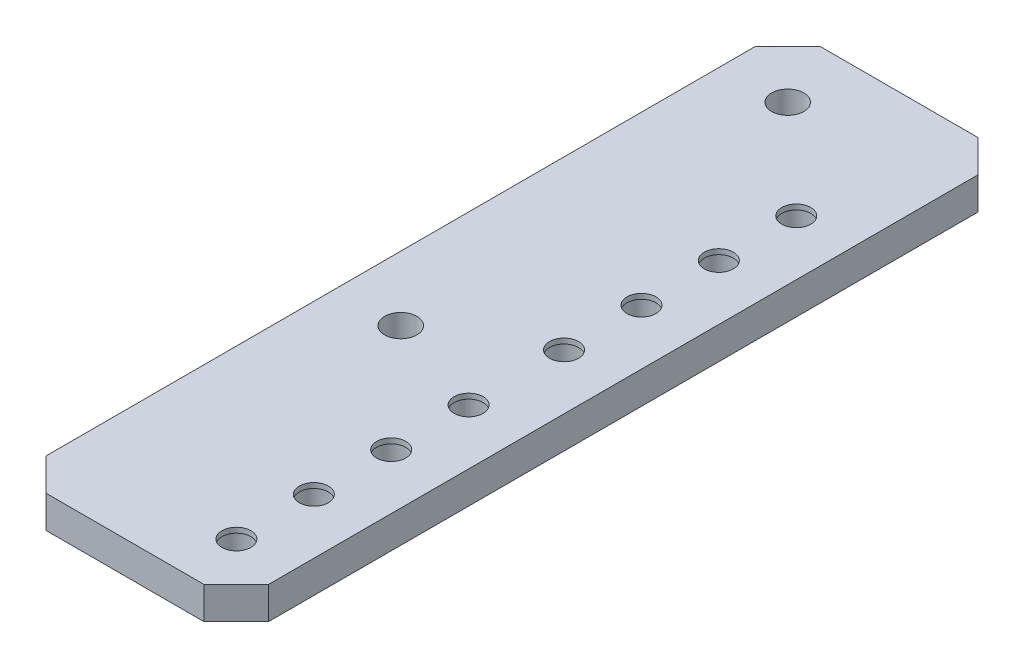
ISO-10303-21;
HEADER;
FILE_DESCRIPTION(('STEP AP214'),'2;1');
FILE_NAME('part.step','',(''),(''),'','','');
FILE_SCHEMA(('AUTOMOTIVE_DESIGN { 1 0 10303 214 1 1 1 1 }'));
ENDSEC;
DATA;
#1=APPLICATION_CONTEXT('core data for automotive mechanical design processes');
#2=APPLICATION_PROTOCOL_DEFINITION('international standard','automotive_design',2000,#1);
#3=PRODUCT_CONTEXT('',#1,'mechanical');
#4=PRODUCT('Part','Part','',(#3));
#5=PRODUCT_RELATED_PRODUCT_CATEGORY('part','',(#4));
#6=PRODUCT_DEFINITION_FORMATION('','',#4);
#7=PRODUCT_DEFINITION_CONTEXT('part definition',#1,'design');
#8=PRODUCT_DEFINITION('design','',#6,#7);
#9=PRODUCT_DEFINITION_SHAPE('','',#8);
#10=(LENGTH_UNIT() NAMED_UNIT(*) SI_UNIT(.MILLI.,.METRE.));
#11=(NAMED_UNIT(*) PLANE_ANGLE_UNIT() SI_UNIT($,.RADIAN.));
#12=(NAMED_UNIT(*) SI_UNIT($,.STERADIAN.) SOLID_ANGLE_UNIT());
#13=UNCERTAINTY_MEASURE_WITH_UNIT(LENGTH_MEASURE(1.E-05),#10,'distance_accuracy_value','');
#14=(GEOMETRIC_REPRESENTATION_CONTEXT(3) GLOBAL_UNCERTAINTY_ASSIGNED_CONTEXT((#13)) GLOBAL_UNIT_ASSIGNED_CONTEXT((#10,
#11,#12)) REPRESENTATION_CONTEXT('',''));
#15=CARTESIAN_POINT('',(0.,0.,0.));
#16=DIRECTION('',(0.,0.,1.));
#17=DIRECTION('',(1.,0.,0.));
#18=AXIS2_PLACEMENT_3D('',#15,#16,#17);
#19=CARTESIAN_POINT('',(17.25,5.,60.));
#20=DIRECTION('',(-1.,0.,0.));
#21=DIRECTION('',(0.,0.,1.));
#22=AXIS2_PLACEMENT_3D('',#19,#20,#21);
#23=PLANE('',#22);
#24=DIRECTION('',(0.,0.,-1.));
#25=VECTOR('',#24,1.);
#26=CARTESIAN_POINT('',(17.25,0.,60.));
#27=LINE('',#26,#25);
#28=CARTESIAN_POINT('',(17.25,0.,55.));
#29=VERTEX_POINT('',#28);
#30=CARTESIAN_POINT('',(17.25,0.,-55.));
#31=VERTEX_POINT('',#30);
#32=EDGE_CURVE('E139',#29,#31,#27,.T.);
#33=ORIENTED_EDGE('',*,*,#32,.T.);
#34=DIRECTION('',(0.,1.,0.));
#35=VECTOR('',#34,1.);
#36=CARTESIAN_POINT('',(17.25,5.,-55.));
#37=LINE('',#36,#35);
#38=CARTESIAN_POINT('',(17.25,5.,-55.));
#39=VERTEX_POINT('',#38);
#40=EDGE_CURVE('E114',#31,#39,#37,.T.);
#41=ORIENTED_EDGE('',*,*,#40,.T.);
#42=DIRECTION('',(0.,0.,-1.));
#43=VECTOR('',#42,1.);
#44=CARTESIAN_POINT('',(17.25,5.,60.));
#45=LINE('',#44,#43);
#46=CARTESIAN_POINT('',(17.25,5.,55.));
#47=VERTEX_POINT('',#46);
#48=EDGE_CURVE('E152',#47,#39,#45,.T.);
#49=ORIENTED_EDGE('',*,*,#48,.F.);
#50=DIRECTION('',(0.,-1.,0.));
#51=VECTOR('',#50,1.);
#52=CARTESIAN_POINT('',(17.25,5.,55.));
#53=LINE('',#52,#51);
#54=EDGE_CURVE('E120',#47,#29,#53,.T.);
#55=ORIENTED_EDGE('',*,*,#54,.T.);
#56=EDGE_LOOP('',(#33,#41,#49,#55));
#57=FACE_BOUND('',#56,.T.);
#58=ADVANCED_FACE('F41',(#57),#23,.F.);
#59=CARTESIAN_POINT('',(-17.25,5.,-60.));
#60=DIRECTION('',(0.,0.,1.));
#61=DIRECTION('',(1.,0.,0.));
#62=AXIS2_PLACEMENT_3D('',#59,#60,#61);
#63=PLANE('',#62);
#64=DIRECTION('',(-1.,0.,0.));
#65=VECTOR('',#64,1.);
#66=CARTESIAN_POINT('',(-17.25,5.,-60.));
#67=LINE('',#66,#65);
#68=CARTESIAN_POINT('',(12.25,5.,-60.));
#69=VERTEX_POINT('',#68);
#70=CARTESIAN_POINT('',(-12.25,5.,-60.));
#71=VERTEX_POINT('',#70);
#72=EDGE_CURVE('E130',#69,#71,#67,.T.);
#73=ORIENTED_EDGE('',*,*,#72,.F.);
#74=DIRECTION('',(0.,-1.,0.));
#75=VECTOR('',#74,1.);
#76=CARTESIAN_POINT('',(12.25,5.,-60.));
#77=LINE('',#76,#75);
#78=CARTESIAN_POINT('',(12.25,0.,-60.));
#79=VERTEX_POINT('',#78);
#80=EDGE_CURVE('E113',#69,#79,#77,.T.);
#81=ORIENTED_EDGE('',*,*,#80,.T.);
#82=DIRECTION('',(-1.,0.,0.));
#83=VECTOR('',#82,1.);
#84=CARTESIAN_POINT('',(-17.25,0.,-60.));
#85=LINE('',#84,#83);
#86=CARTESIAN_POINT('',(-12.25,0.,-60.));
#87=VERTEX_POINT('',#86);
#88=EDGE_CURVE('E127',#79,#87,#85,.T.);
#89=ORIENTED_EDGE('',*,*,#88,.T.);
#90=DIRECTION('',(0.,1.,0.));
#91=VECTOR('',#90,1.);
#92=CARTESIAN_POINT('',(-12.25,5.,-60.));
#93=LINE('',#92,#91);
#94=EDGE_CURVE('E133',#87,#71,#93,.T.);
#95=ORIENTED_EDGE('',*,*,#94,.T.);
#96=EDGE_LOOP('',(#73,#81,#89,#95));
#97=FACE_BOUND('',#96,.T.);
#98=ADVANCED_FACE('F126',(#97),#63,.F.);
#99=CARTESIAN_POINT('',(-17.25,5.,60.));
#100=DIRECTION('',(1.,0.,0.));
#101=DIRECTION('',(0.,0.,-1.));
#102=AXIS2_PLACEMENT_3D('',#99,#100,#101);
#103=PLANE('',#102);
#104=DIRECTION('',(0.,0.,1.));
#105=VECTOR('',#104,1.);
#106=CARTESIAN_POINT('',(-17.25,0.,60.));
#107=LINE('',#106,#105);
#108=CARTESIAN_POINT('',(-17.25,0.,-55.));
#109=VERTEX_POINT('',#108);
#110=CARTESIAN_POINT('',(-17.25,0.,55.));
#111=VERTEX_POINT('',#110);
#112=EDGE_CURVE('E138',#109,#111,#107,.T.);
#113=ORIENTED_EDGE('',*,*,#112,.T.);
#114=DIRECTION('',(0.,1.,0.));
#115=VECTOR('',#114,1.);
#116=CARTESIAN_POINT('',(-17.25,5.,55.));
#117=LINE('',#116,#115);
#118=CARTESIAN_POINT('',(-17.25,5.,55.));
#119=VERTEX_POINT('',#118);
#120=EDGE_CURVE('E11',#111,#119,#117,.T.);
#121=ORIENTED_EDGE('',*,*,#120,.T.);
#122=DIRECTION('',(0.,0.,1.));
#123=VECTOR('',#122,1.);
#124=CARTESIAN_POINT('',(-17.25,5.,60.));
#125=LINE('',#124,#123);
#126=CARTESIAN_POINT('',(-17.25,5.,-55.));
#127=VERTEX_POINT('',#126);
#128=EDGE_CURVE('E249',#127,#119,#125,.T.);
#129=ORIENTED_EDGE('',*,*,#128,.F.);
#130=DIRECTION('',(0.,-1.,0.));
#131=VECTOR('',#130,1.);
#132=CARTESIAN_POINT('',(-17.25,5.,-55.));
#133=LINE('',#132,#131);
#134=EDGE_CURVE('E51',#127,#109,#133,.T.);
#135=ORIENTED_EDGE('',*,*,#134,.T.);
#136=EDGE_LOOP('',(#113,#121,#129,#135));
#137=FACE_BOUND('',#136,.T.);
#138=ADVANCED_FACE('F247',(#137),#103,.F.);
#139=CARTESIAN_POINT('',(-17.25,5.,60.));
#140=DIRECTION('',(0.,0.,-1.));
#141=DIRECTION('',(-1.,0.,0.));
#142=AXIS2_PLACEMENT_3D('',#139,#140,#141);
#143=PLANE('',#142);
#144=DIRECTION('',(1.,0.,0.));
#145=VECTOR('',#144,1.);
#146=CARTESIAN_POINT('',(-17.25,0.,60.));
#147=LINE('',#146,#145);
#148=CARTESIAN_POINT('',(-12.25,0.,60.));
#149=VERTEX_POINT('',#148);
#150=CARTESIAN_POINT('',(12.25,0.,60.));
#151=VERTEX_POINT('',#150);
#152=EDGE_CURVE('E144',#149,#151,#147,.T.);
#153=ORIENTED_EDGE('',*,*,#152,.T.);
#154=DIRECTION('',(0.,1.,0.));
#155=VECTOR('',#154,1.);
#156=CARTESIAN_POINT('',(12.25,5.,60.));
#157=LINE('',#156,#155);
#158=CARTESIAN_POINT('',(12.25,5.,60.));
#159=VERTEX_POINT('',#158);
#160=EDGE_CURVE('E58',#151,#159,#157,.T.);
#161=ORIENTED_EDGE('',*,*,#160,.T.);
#162=DIRECTION('',(1.,0.,0.));
#163=VECTOR('',#162,1.);
#164=CARTESIAN_POINT('',(-17.25,5.,60.));
#165=LINE('',#164,#163);
#166=CARTESIAN_POINT('',(-12.25,5.,60.));
#167=VERTEX_POINT('',#166);
#168=EDGE_CURVE('E212',#167,#159,#165,.T.);
#169=ORIENTED_EDGE('',*,*,#168,.F.);
#170=DIRECTION('',(0.,-1.,0.));
#171=VECTOR('',#170,1.);
#172=CARTESIAN_POINT('',(-12.25,5.,60.));
#173=LINE('',#172,#171);
#174=EDGE_CURVE('E237',#167,#149,#173,.T.);
#175=ORIENTED_EDGE('',*,*,#174,.T.);
#176=EDGE_LOOP('',(#153,#161,#169,#175));
#177=FACE_BOUND('',#176,.T.);
#178=ADVANCED_FACE('F256',(#177),#143,.F.);
#179=CARTESIAN_POINT('',(0.,5.,0.));
#180=DIRECTION('',(0.,-1.,0.));
#181=DIRECTION('',(0.,0.,-1.));
#182=AXIS2_PLACEMENT_3D('',#179,#180,#181);
#183=PLANE('',#182);
#184=CARTESIAN_POINT('',(8.67200000000001,5.,0.600000000000003));
#185=DIRECTION('',(0.,-1.,0.));
#186=DIRECTION('',(0.,0.,-1.));
#187=AXIS2_PLACEMENT_3D('',#184,#185,#186);
#188=CIRCLE('',#187,2.25);
#189=CARTESIAN_POINT('',(8.67200000000001,5.,-1.65));
#190=VERTEX_POINT('',#189);
#191=EDGE_CURVE('E205',#190,#190,#188,.T.);
#192=ORIENTED_EDGE('',*,*,#191,.T.);
#193=EDGE_LOOP('',(#192));
#194=FACE_BOUND('',#193,.T.);
#195=CARTESIAN_POINT('',(8.67200000000001,5.,51.4));
#196=DIRECTION('',(0.,-1.,0.));
#197=DIRECTION('',(0.,0.,-1.));
#198=AXIS2_PLACEMENT_3D('',#195,#196,#197);
#199=CIRCLE('',#198,2.25);
#200=CARTESIAN_POINT('',(8.67200000000001,5.,49.15));
#201=VERTEX_POINT('',#200);
#202=EDGE_CURVE('E199',#201,#201,#199,.T.);
#203=ORIENTED_EDGE('',*,*,#202,.T.);
#204=EDGE_LOOP('',(#203));
#205=FACE_BOUND('',#204,.T.);
#206=CARTESIAN_POINT('',(8.67200000000001,5.,-11.4));
#207=DIRECTION('',(0.,-1.,0.));
#208=DIRECTION('',(0.,0.,-1.));
#209=AXIS2_PLACEMENT_3D('',#206,#207,#208);
#210=CIRCLE('',#209,2.25);
#211=CARTESIAN_POINT('',(8.67200000000001,5.,-13.65));
#212=VERTEX_POINT('',#211);
#213=EDGE_CURVE('E193',#212,#212,#210,.T.);
#214=ORIENTED_EDGE('',*,*,#213,.T.);
#215=EDGE_LOOP('',(#214));
#216=FACE_BOUND('',#215,.T.);
#217=CARTESIAN_POINT('',(8.67200000000001,5.,39.4));
#218=DIRECTION('',(0.,-1.,0.));
#219=DIRECTION('',(0.,0.,-1.));
#220=AXIS2_PLACEMENT_3D('',#217,#218,#219);
#221=CIRCLE('',#220,2.25);
#222=CARTESIAN_POINT('',(8.67200000000001,5.,37.15));
#223=VERTEX_POINT('',#222);
#224=EDGE_CURVE('E187',#223,#223,#221,.T.);
#225=ORIENTED_EDGE('',*,*,#224,.T.);
#226=EDGE_LOOP('',(#225));
#227=FACE_BOUND('',#226,.T.);
#228=CARTESIAN_POINT('',(8.67200000000001,5.,-23.4));
#229=DIRECTION('',(0.,-1.,0.));
#230=DIRECTION('',(0.,0.,-1.));
#231=AXIS2_PLACEMENT_3D('',#228,#229,#230);
#232=CIRCLE('',#231,2.25);
#233=CARTESIAN_POINT('',(8.67200000000001,5.,-25.65));
#234=VERTEX_POINT('',#233);
#235=EDGE_CURVE('E181',#234,#234,#232,.T.);
#236=ORIENTED_EDGE('',*,*,#235,.T.);
#237=EDGE_LOOP('',(#236));
#238=FACE_BOUND('',#237,.T.);
#239=CARTESIAN_POINT('',(8.67200000000001,5.,27.4));
#240=DIRECTION('',(0.,-1.,0.));
#241=DIRECTION('',(0.,0.,-1.));
#242=AXIS2_PLACEMENT_3D('',#239,#240,#241);
#243=CIRCLE('',#242,2.25);
#244=CARTESIAN_POINT('',(8.67200000000001,5.,25.15));
#245=VERTEX_POINT('',#244);
#246=EDGE_CURVE('E175',#245,#245,#243,.T.);
#247=ORIENTED_EDGE('',*,*,#246,.T.);
#248=EDGE_LOOP('',(#247));
#249=FACE_BOUND('',#248,.T.);
#250=CARTESIAN_POINT('',(8.67200000000001,5.,-35.4));
#251=DIRECTION('',(0.,-1.,0.));
#252=DIRECTION('',(0.,0.,-1.));
#253=AXIS2_PLACEMENT_3D('',#250,#251,#252);
#254=CIRCLE('',#253,2.25);
#255=CARTESIAN_POINT('',(8.67200000000001,5.,-37.65));
#256=VERTEX_POINT('',#255);
#257=EDGE_CURVE('E169',#256,#256,#254,.T.);
#258=ORIENTED_EDGE('',*,*,#257,.T.);
#259=EDGE_LOOP('',(#258));
#260=FACE_BOUND('',#259,.T.);
#261=CARTESIAN_POINT('',(8.67200000000001,5.,15.4));
#262=DIRECTION('',(0.,-1.,0.));
#263=DIRECTION('',(0.,0.,-1.));
#264=AXIS2_PLACEMENT_3D('',#261,#262,#263);
#265=CIRCLE('',#264,2.25);
#266=CARTESIAN_POINT('',(8.67200000000001,5.,13.15));
#267=VERTEX_POINT('',#266);
#268=EDGE_CURVE('E163',#267,#267,#265,.T.);
#269=ORIENTED_EDGE('',*,*,#268,.T.);
#270=EDGE_LOOP('',(#269));
#271=FACE_BOUND('',#270,.T.);
#272=CARTESIAN_POINT('',(-7.25,5.,-50.));
#273=DIRECTION('',(0.,1.,0.));
#274=DIRECTION('',(0.,0.,1.));
#275=AXIS2_PLACEMENT_3D('',#272,#273,#274);
#276=CIRCLE('',#275,2.5);
#277=CARTESIAN_POINT('',(-7.25,5.,-47.5));
#278=VERTEX_POINT('',#277);
#279=EDGE_CURVE('E167',#278,#278,#276,.T.);
#280=ORIENTED_EDGE('',*,*,#279,.F.);
#281=EDGE_LOOP('',(#280));
#282=FACE_BOUND('',#281,.T.);
#283=CARTESIAN_POINT('',(-7.24999999999999,5.,10.));
#284=DIRECTION('',(0.,1.,0.));
#285=DIRECTION('',(0.,0.,1.));
#286=AXIS2_PLACEMENT_3D('',#283,#284,#285);
#287=CIRCLE('',#286,2.5);
#288=CARTESIAN_POINT('',(-7.24999999999999,5.,12.5));
#289=VERTEX_POINT('',#288);
#290=EDGE_CURVE('E161',#289,#289,#287,.T.);
#291=ORIENTED_EDGE('',*,*,#290,.F.);
#292=EDGE_LOOP('',(#291));
#293=FACE_BOUND('',#292,.T.);
#294=ORIENTED_EDGE('',*,*,#48,.T.);
#295=DIRECTION('',(0.707106781186546,0.,0.70710678118655));
#296=VECTOR('',#295,1.);
#297=CARTESIAN_POINT('',(12.25,5.,-60.));
#298=LINE('',#297,#296);
#299=EDGE_CURVE('E234',#39,#69,#298,.F.);
#300=ORIENTED_EDGE('',*,*,#299,.T.);
#301=ORIENTED_EDGE('',*,*,#72,.T.);
#302=DIRECTION('',(0.707106781186549,0.,-0.707106781186546));
#303=VECTOR('',#302,1.);
#304=CARTESIAN_POINT('',(-17.25,5.,-55.));
#305=LINE('',#304,#303);
#306=EDGE_CURVE('E226',#71,#127,#305,.F.);
#307=ORIENTED_EDGE('',*,*,#306,.T.);
#308=ORIENTED_EDGE('',*,*,#128,.T.);
#309=DIRECTION('',(-0.707106781186546,0.,-0.70710678118655));
#310=VECTOR('',#309,1.);
#311=CARTESIAN_POINT('',(-12.25,5.,60.));
#312=LINE('',#311,#310);
#313=EDGE_CURVE('E65',#119,#167,#312,.F.);
#314=ORIENTED_EDGE('',*,*,#313,.T.);
#315=ORIENTED_EDGE('',*,*,#168,.T.);
#316=DIRECTION('',(-0.707106781186549,0.,0.707106781186546));
#317=VECTOR('',#316,1.);
#318=CARTESIAN_POINT('',(17.25,5.,55.));
#319=LINE('',#318,#317);
#320=EDGE_CURVE('E231',#159,#47,#319,.F.);
#321=ORIENTED_EDGE('',*,*,#320,.T.);
#322=EDGE_LOOP('',(#294,#300,#301,#307,#308,#314,#315,#321));
#323=FACE_BOUND('',#322,.T.);
#324=ADVANCED_FACE('F374',(#194,#205,#216,#227,#238,#249,#260,#271,#282,#293,#323),#183,.F.);
#325=CARTESIAN_POINT('',(0.,0.,0.));
#326=DIRECTION('',(0.,-1.,0.));
#327=DIRECTION('',(0.,0.,-1.));
#328=AXIS2_PLACEMENT_3D('',#325,#326,#327);
#329=PLANE('',#328);
#330=CARTESIAN_POINT('',(8.67200000000001,0.,0.600000000000003));
#331=DIRECTION('',(0.,-1.,0.));
#332=DIRECTION('',(0.,0.,-1.));
#333=AXIS2_PLACEMENT_3D('',#330,#331,#332);
#334=CIRCLE('',#333,2.5);
#335=CARTESIAN_POINT('',(8.67200000000001,0.,-1.9));
#336=VERTEX_POINT('',#335);
#337=EDGE_CURVE('E364',#336,#336,#334,.T.);
#338=ORIENTED_EDGE('',*,*,#337,.F.);
#339=EDGE_LOOP('',(#338));
#340=FACE_BOUND('',#339,.T.);
#341=CARTESIAN_POINT('',(8.67200000000001,0.,51.4));
#342=DIRECTION('',(0.,-1.,0.));
#343=DIRECTION('',(0.,0.,-1.));
#344=AXIS2_PLACEMENT_3D('',#341,#342,#343);
#345=CIRCLE('',#344,2.5);
#346=CARTESIAN_POINT('',(8.67200000000001,0.,48.9));
#347=VERTEX_POINT('',#346);
#348=EDGE_CURVE('E209',#347,#347,#345,.T.);
#349=ORIENTED_EDGE('',*,*,#348,.F.);
#350=EDGE_LOOP('',(#349));
#351=FACE_BOUND('',#350,.T.);
#352=CARTESIAN_POINT('',(8.67200000000001,0.,-11.4));
#353=DIRECTION('',(0.,-1.,0.));
#354=DIRECTION('',(0.,0.,-1.));
#355=AXIS2_PLACEMENT_3D('',#352,#353,#354);
#356=CIRCLE('',#355,2.5);
#357=CARTESIAN_POINT('',(8.67200000000001,0.,-13.9));
#358=VERTEX_POINT('',#357);
#359=EDGE_CURVE('E203',#358,#358,#356,.T.);
#360=ORIENTED_EDGE('',*,*,#359,.F.);
#361=EDGE_LOOP('',(#360));
#362=FACE_BOUND('',#361,.T.);
#363=CARTESIAN_POINT('',(8.67200000000001,0.,39.4));
#364=DIRECTION('',(0.,-1.,0.));
#365=DIRECTION('',(0.,0.,-1.));
#366=AXIS2_PLACEMENT_3D('',#363,#364,#365);
#367=CIRCLE('',#366,2.5);
#368=CARTESIAN_POINT('',(8.67200000000001,0.,36.9));
#369=VERTEX_POINT('',#368);
#370=EDGE_CURVE('E197',#369,#369,#367,.T.);
#371=ORIENTED_EDGE('',*,*,#370,.F.);
#372=EDGE_LOOP('',(#371));
#373=FACE_BOUND('',#372,.T.);
#374=CARTESIAN_POINT('',(8.67200000000001,0.,-23.4));
#375=DIRECTION('',(0.,-1.,0.));
#376=DIRECTION('',(0.,0.,-1.));
#377=AXIS2_PLACEMENT_3D('',#374,#375,#376);
#378=CIRCLE('',#377,2.5);
#379=CARTESIAN_POINT('',(8.67200000000001,0.,-25.9));
#380=VERTEX_POINT('',#379);
#381=EDGE_CURVE('E191',#380,#380,#378,.T.);
#382=ORIENTED_EDGE('',*,*,#381,.F.);
#383=EDGE_LOOP('',(#382));
#384=FACE_BOUND('',#383,.T.);
#385=CARTESIAN_POINT('',(8.67200000000001,0.,27.4));
#386=DIRECTION('',(0.,-1.,0.));
#387=DIRECTION('',(0.,0.,-1.));
#388=AXIS2_PLACEMENT_3D('',#385,#386,#387);
#389=CIRCLE('',#388,2.5);
#390=CARTESIAN_POINT('',(8.67200000000001,0.,24.9));
#391=VERTEX_POINT('',#390);
#392=EDGE_CURVE('E185',#391,#391,#389,.T.);
#393=ORIENTED_EDGE('',*,*,#392,.F.);
#394=EDGE_LOOP('',(#393));
#395=FACE_BOUND('',#394,.T.);
#396=CARTESIAN_POINT('',(8.67200000000001,0.,-35.4));
#397=DIRECTION('',(0.,-1.,0.));
#398=DIRECTION('',(0.,0.,-1.));
#399=AXIS2_PLACEMENT_3D('',#396,#397,#398);
#400=CIRCLE('',#399,2.5);
#401=CARTESIAN_POINT('',(8.67200000000001,0.,-37.9));
#402=VERTEX_POINT('',#401);
#403=EDGE_CURVE('E179',#402,#402,#400,.T.);
#404=ORIENTED_EDGE('',*,*,#403,.F.);
#405=EDGE_LOOP('',(#404));
#406=FACE_BOUND('',#405,.T.);
#407=CARTESIAN_POINT('',(8.67200000000001,0.,15.4));
#408=DIRECTION('',(0.,-1.,0.));
#409=DIRECTION('',(0.,0.,-1.));
#410=AXIS2_PLACEMENT_3D('',#407,#408,#409);
#411=CIRCLE('',#410,2.5);
#412=CARTESIAN_POINT('',(8.67200000000001,0.,12.9));
#413=VERTEX_POINT('',#412);
#414=EDGE_CURVE('E173',#413,#413,#411,.T.);
#415=ORIENTED_EDGE('',*,*,#414,.F.);
#416=EDGE_LOOP('',(#415));
#417=FACE_BOUND('',#416,.T.);
#418=CARTESIAN_POINT('',(-7.25,0.,-50.));
#419=DIRECTION('',(0.,-1.,0.));
#420=DIRECTION('',(0.,0.,-1.));
#421=AXIS2_PLACEMENT_3D('',#418,#419,#420);
#422=CIRCLE('',#421,2.25);
#423=CARTESIAN_POINT('',(-7.25,0.,-52.25));
#424=VERTEX_POINT('',#423);
#425=EDGE_CURVE('E157',#424,#424,#422,.T.);
#426=ORIENTED_EDGE('',*,*,#425,.F.);
#427=EDGE_LOOP('',(#426));
#428=FACE_BOUND('',#427,.T.);
#429=CARTESIAN_POINT('',(-7.24999999999999,0.,10.));
#430=DIRECTION('',(0.,-1.,0.));
#431=DIRECTION('',(0.,0.,-1.));
#432=AXIS2_PLACEMENT_3D('',#429,#430,#431);
#433=CIRCLE('',#432,2.25);
#434=CARTESIAN_POINT('',(-7.24999999999999,0.,7.75000000000001));
#435=VERTEX_POINT('',#434);
#436=EDGE_CURVE('E146',#435,#435,#433,.T.);
#437=ORIENTED_EDGE('',*,*,#436,.F.);
#438=EDGE_LOOP('',(#437));
#439=FACE_BOUND('',#438,.T.);
#440=ORIENTED_EDGE('',*,*,#88,.F.);
#441=DIRECTION('',(-0.707106781186546,0.,-0.70710678118655));
#442=VECTOR('',#441,1.);
#443=CARTESIAN_POINT('',(36.125,0.,-36.1249999999998));
#444=LINE('',#443,#442);
#445=EDGE_CURVE('E109',#79,#31,#444,.F.);
#446=ORIENTED_EDGE('',*,*,#445,.T.);
#447=ORIENTED_EDGE('',*,*,#32,.F.);
#448=DIRECTION('',(0.707106781186549,0.,-0.707106781186546));
#449=VECTOR('',#448,1.);
#450=CARTESIAN_POINT('',(36.125,0.,36.1250000000001));
#451=LINE('',#450,#449);
#452=EDGE_CURVE('E121',#29,#151,#451,.F.);
#453=ORIENTED_EDGE('',*,*,#452,.T.);
#454=ORIENTED_EDGE('',*,*,#152,.F.);
#455=DIRECTION('',(0.707106781186546,0.,0.70710678118655));
#456=VECTOR('',#455,1.);
#457=CARTESIAN_POINT('',(-36.125,0.,36.1249999999998));
#458=LINE('',#457,#456);
#459=EDGE_CURVE('E216',#149,#111,#458,.F.);
#460=ORIENTED_EDGE('',*,*,#459,.T.);
#461=ORIENTED_EDGE('',*,*,#112,.F.);
#462=DIRECTION('',(-0.707106781186549,0.,0.707106781186546));
#463=VECTOR('',#462,1.);
#464=CARTESIAN_POINT('',(-36.125,0.,-36.1250000000001));
#465=LINE('',#464,#463);
#466=EDGE_CURVE('E132',#109,#87,#465,.F.);
#467=ORIENTED_EDGE('',*,*,#466,.T.);
#468=EDGE_LOOP('',(#440,#446,#447,#453,#454,#460,#461,#467));
#469=FACE_BOUND('',#468,.T.);
#470=ADVANCED_FACE('F135',(#340,#351,#362,#373,#384,#395,#406,#417,#428,#439,#469),#329,.T.);
#471=CARTESIAN_POINT('',(-7.24999999999999,5.,10.));
#472=DIRECTION('',(0.,1.,0.));
#473=DIRECTION('',(0.,0.,1.));
#474=AXIS2_PLACEMENT_3D('',#471,#472,#473);
#475=CYLINDRICAL_SURFACE('',#474,2.25);
#476=ORIENTED_EDGE('',*,*,#436,.T.);
#477=EDGE_LOOP('',(#476));
#478=FACE_BOUND('',#477,.T.);
#479=CARTESIAN_POINT('',(-7.24999999999999,0.799999999999999,10.));
#480=DIRECTION('',(0.,1.,0.));
#481=DIRECTION('',(0.,0.,1.));
#482=AXIS2_PLACEMENT_3D('',#479,#480,#481);
#483=CIRCLE('',#482,2.25);
#484=CARTESIAN_POINT('',(-7.24999999999999,0.799999999999999,12.25));
#485=VERTEX_POINT('',#484);
#486=EDGE_CURVE('E156',#485,#485,#483,.T.);
#487=ORIENTED_EDGE('',*,*,#486,.T.);
#488=EDGE_LOOP('',(#487));
#489=FACE_BOUND('',#488,.T.);
#490=ADVANCED_FACE('F373',(#478,#489),#475,.F.);
#491=CARTESIAN_POINT('',(-4.99999999999999,0.799999999999999,10.));
#492=DIRECTION('',(0.,-1.,0.));
#493=DIRECTION('',(0.,0.,-1.));
#494=AXIS2_PLACEMENT_3D('',#491,#492,#493);
#495=PLANE('',#494);
#496=ORIENTED_EDGE('',*,*,#486,.F.);
#497=EDGE_LOOP('',(#496));
#498=FACE_BOUND('',#497,.T.);
#499=CARTESIAN_POINT('',(-7.24999999999999,0.799999999999999,10.));
#500=DIRECTION('',(0.,1.,0.));
#501=DIRECTION('',(0.,0.,1.));
#502=AXIS2_PLACEMENT_3D('',#499,#500,#501);
#503=CIRCLE('',#502,2.5);
#504=CARTESIAN_POINT('',(-7.24999999999999,0.799999999999999,12.5));
#505=VERTEX_POINT('',#504);
#506=EDGE_CURVE('E270',#505,#505,#503,.T.);
#507=ORIENTED_EDGE('',*,*,#506,.T.);
#508=EDGE_LOOP('',(#507));
#509=FACE_BOUND('',#508,.T.);
#510=ADVANCED_FACE('F396',(#498,#509),#495,.F.);
#511=CARTESIAN_POINT('',(-7.24999999999999,5.,10.));
#512=DIRECTION('',(0.,1.,0.));
#513=DIRECTION('',(0.,0.,1.));
#514=AXIS2_PLACEMENT_3D('',#511,#512,#513);
#515=CYLINDRICAL_SURFACE('',#514,2.5);
#516=ORIENTED_EDGE('',*,*,#506,.F.);
#517=EDGE_LOOP('',(#516));
#518=FACE_BOUND('',#517,.T.);
#519=ORIENTED_EDGE('',*,*,#290,.T.);
#520=EDGE_LOOP('',(#519));
#521=FACE_BOUND('',#520,.T.);
#522=ADVANCED_FACE('F402',(#518,#521),#515,.F.);
#523=CARTESIAN_POINT('',(-7.25,5.,-50.));
#524=DIRECTION('',(0.,1.,0.));
#525=DIRECTION('',(0.,0.,1.));
#526=AXIS2_PLACEMENT_3D('',#523,#524,#525);
#527=CYLINDRICAL_SURFACE('',#526,2.25);
#528=ORIENTED_EDGE('',*,*,#425,.T.);
#529=EDGE_LOOP('',(#528));
#530=FACE_BOUND('',#529,.T.);
#531=CARTESIAN_POINT('',(-7.25,0.799999999999999,-50.));
#532=DIRECTION('',(0.,1.,0.));
#533=DIRECTION('',(0.,0.,1.));
#534=AXIS2_PLACEMENT_3D('',#531,#532,#533);
#535=CIRCLE('',#534,2.25);
#536=CARTESIAN_POINT('',(-7.25,0.799999999999999,-47.75));
#537=VERTEX_POINT('',#536);
#538=EDGE_CURVE('E162',#537,#537,#535,.T.);
#539=ORIENTED_EDGE('',*,*,#538,.T.);
#540=EDGE_LOOP('',(#539));
#541=FACE_BOUND('',#540,.T.);
#542=ADVANCED_FACE('F408',(#530,#541),#527,.F.);
#543=CARTESIAN_POINT('',(-5.,0.799999999999999,-50.));
#544=DIRECTION('',(0.,-1.,0.));
#545=DIRECTION('',(0.,0.,-1.));
#546=AXIS2_PLACEMENT_3D('',#543,#544,#545);
#547=PLANE('',#546);
#548=ORIENTED_EDGE('',*,*,#538,.F.);
#549=EDGE_LOOP('',(#548));
#550=FACE_BOUND('',#549,.T.);
#551=CARTESIAN_POINT('',(-7.25,0.799999999999999,-50.));
#552=DIRECTION('',(0.,1.,0.));
#553=DIRECTION('',(0.,0.,1.));
#554=AXIS2_PLACEMENT_3D('',#551,#552,#553);
#555=CIRCLE('',#554,2.5);
#556=CARTESIAN_POINT('',(-7.25,0.799999999999999,-47.5));
#557=VERTEX_POINT('',#556);
#558=EDGE_CURVE('E280',#557,#557,#555,.T.);
#559=ORIENTED_EDGE('',*,*,#558,.T.);
#560=EDGE_LOOP('',(#559));
#561=FACE_BOUND('',#560,.T.);
#562=ADVANCED_FACE('F451',(#550,#561),#547,.F.);
#563=CARTESIAN_POINT('',(-7.25,5.,-50.));
#564=DIRECTION('',(0.,1.,0.));
#565=DIRECTION('',(0.,0.,1.));
#566=AXIS2_PLACEMENT_3D('',#563,#564,#565);
#567=CYLINDRICAL_SURFACE('',#566,2.5);
#568=ORIENTED_EDGE('',*,*,#558,.F.);
#569=EDGE_LOOP('',(#568));
#570=FACE_BOUND('',#569,.T.);
#571=ORIENTED_EDGE('',*,*,#279,.T.);
#572=EDGE_LOOP('',(#571));
#573=FACE_BOUND('',#572,.T.);
#574=ADVANCED_FACE('F455',(#570,#573),#567,.F.);
#575=CARTESIAN_POINT('',(8.67200000000001,0.,15.4));
#576=DIRECTION('',(0.,-1.,0.));
#577=DIRECTION('',(0.,0.,-1.));
#578=AXIS2_PLACEMENT_3D('',#575,#576,#577);
#579=CYLINDRICAL_SURFACE('',#578,2.25);
#580=CARTESIAN_POINT('',(8.67200000000001,4.2,15.4));
#581=DIRECTION('',(0.,-1.,0.));
#582=DIRECTION('',(0.,0.,-1.));
#583=AXIS2_PLACEMENT_3D('',#580,#581,#582);
#584=CIRCLE('',#583,2.25);
#585=CARTESIAN_POINT('',(8.67200000000001,4.2,13.15));
#586=VERTEX_POINT('',#585);
#587=EDGE_CURVE('E168',#586,#586,#584,.T.);
#588=ORIENTED_EDGE('',*,*,#587,.T.);
#589=EDGE_LOOP('',(#588));
#590=FACE_BOUND('',#589,.T.);
#591=ORIENTED_EDGE('',*,*,#268,.F.);
#592=EDGE_LOOP('',(#591));
#593=FACE_BOUND('',#592,.T.);
#594=ADVANCED_FACE('F459',(#590,#593),#579,.F.);
#595=CARTESIAN_POINT('',(10.922,4.2,15.4));
#596=DIRECTION('',(0.,1.,0.));
#597=DIRECTION('',(0.,0.,1.));
#598=AXIS2_PLACEMENT_3D('',#595,#596,#597);
#599=PLANE('',#598);
#600=ORIENTED_EDGE('',*,*,#587,.F.);
#601=EDGE_LOOP('',(#600));
#602=FACE_BOUND('',#601,.T.);
#603=CARTESIAN_POINT('',(8.67200000000001,4.2,15.4));
#604=DIRECTION('',(0.,-1.,0.));
#605=DIRECTION('',(0.,0.,-1.));
#606=AXIS2_PLACEMENT_3D('',#603,#604,#605);
#607=CIRCLE('',#606,2.5);
#608=CARTESIAN_POINT('',(8.67200000000001,4.2,12.9));
#609=VERTEX_POINT('',#608);
#610=EDGE_CURVE('E290',#609,#609,#607,.T.);
#611=ORIENTED_EDGE('',*,*,#610,.T.);
#612=EDGE_LOOP('',(#611));
#613=FACE_BOUND('',#612,.T.);
#614=ADVANCED_FACE('F463',(#602,#613),#599,.F.);
#615=CARTESIAN_POINT('',(8.67200000000001,0.,15.4));
#616=DIRECTION('',(0.,-1.,0.));
#617=DIRECTION('',(0.,0.,-1.));
#618=AXIS2_PLACEMENT_3D('',#615,#616,#617);
#619=CYLINDRICAL_SURFACE('',#618,2.5);
#620=ORIENTED_EDGE('',*,*,#610,.F.);
#621=EDGE_LOOP('',(#620));
#622=FACE_BOUND('',#621,.T.);
#623=ORIENTED_EDGE('',*,*,#414,.T.);
#624=EDGE_LOOP('',(#623));
#625=FACE_BOUND('',#624,.T.);
#626=ADVANCED_FACE('F467',(#622,#625),#619,.F.);
#627=CARTESIAN_POINT('',(8.67200000000001,0.,-35.4));
#628=DIRECTION('',(0.,-1.,0.));
#629=DIRECTION('',(0.,0.,-1.));
#630=AXIS2_PLACEMENT_3D('',#627,#628,#629);
#631=CYLINDRICAL_SURFACE('',#630,2.25);
#632=CARTESIAN_POINT('',(8.67200000000001,4.2,-35.4));
#633=DIRECTION('',(0.,-1.,0.));
#634=DIRECTION('',(0.,0.,-1.));
#635=AXIS2_PLACEMENT_3D('',#632,#633,#634);
#636=CIRCLE('',#635,2.25);
#637=CARTESIAN_POINT('',(8.67200000000001,4.2,-37.65));
#638=VERTEX_POINT('',#637);
#639=EDGE_CURVE('E174',#638,#638,#636,.T.);
#640=ORIENTED_EDGE('',*,*,#639,.T.);
#641=EDGE_LOOP('',(#640));
#642=FACE_BOUND('',#641,.T.);
#643=ORIENTED_EDGE('',*,*,#257,.F.);
#644=EDGE_LOOP('',(#643));
#645=FACE_BOUND('',#644,.T.);
#646=ADVANCED_FACE('F471',(#642,#645),#631,.F.);
#647=CARTESIAN_POINT('',(10.922,4.2,-35.4));
#648=DIRECTION('',(0.,1.,0.));
#649=DIRECTION('',(0.,0.,1.));
#650=AXIS2_PLACEMENT_3D('',#647,#648,#649);
#651=PLANE('',#650);
#652=ORIENTED_EDGE('',*,*,#639,.F.);
#653=EDGE_LOOP('',(#652));
#654=FACE_BOUND('',#653,.T.);
#655=CARTESIAN_POINT('',(8.67200000000001,4.2,-35.4));
#656=DIRECTION('',(0.,-1.,0.));
#657=DIRECTION('',(0.,0.,-1.));
#658=AXIS2_PLACEMENT_3D('',#655,#656,#657);
#659=CIRCLE('',#658,2.5);
#660=CARTESIAN_POINT('',(8.67200000000001,4.2,-37.9));
#661=VERTEX_POINT('',#660);
#662=EDGE_CURVE('E300',#661,#661,#659,.T.);
#663=ORIENTED_EDGE('',*,*,#662,.T.);
#664=EDGE_LOOP('',(#663));
#665=FACE_BOUND('',#664,.T.);
#666=ADVANCED_FACE('F475',(#654,#665),#651,.F.);
#667=CARTESIAN_POINT('',(8.67200000000001,0.,-35.4));
#668=DIRECTION('',(0.,-1.,0.));
#669=DIRECTION('',(0.,0.,-1.));
#670=AXIS2_PLACEMENT_3D('',#667,#668,#669);
#671=CYLINDRICAL_SURFACE('',#670,2.5);
#672=ORIENTED_EDGE('',*,*,#662,.F.);
#673=EDGE_LOOP('',(#672));
#674=FACE_BOUND('',#673,.T.);
#675=ORIENTED_EDGE('',*,*,#403,.T.);
#676=EDGE_LOOP('',(#675));
#677=FACE_BOUND('',#676,.T.);
#678=ADVANCED_FACE('F479',(#674,#677),#671,.F.);
#679=CARTESIAN_POINT('',(8.67200000000001,0.,27.4));
#680=DIRECTION('',(0.,-1.,0.));
#681=DIRECTION('',(0.,0.,-1.));
#682=AXIS2_PLACEMENT_3D('',#679,#680,#681);
#683=CYLINDRICAL_SURFACE('',#682,2.25);
#684=CARTESIAN_POINT('',(8.67200000000001,4.2,27.4));
#685=DIRECTION('',(0.,-1.,0.));
#686=DIRECTION('',(0.,0.,-1.));
#687=AXIS2_PLACEMENT_3D('',#684,#685,#686);
#688=CIRCLE('',#687,2.25);
#689=CARTESIAN_POINT('',(8.67200000000001,4.2,25.15));
#690=VERTEX_POINT('',#689);
#691=EDGE_CURVE('E180',#690,#690,#688,.T.);
#692=ORIENTED_EDGE('',*,*,#691,.T.);
#693=EDGE_LOOP('',(#692));
#694=FACE_BOUND('',#693,.T.);
#695=ORIENTED_EDGE('',*,*,#246,.F.);
#696=EDGE_LOOP('',(#695));
#697=FACE_BOUND('',#696,.T.);
#698=ADVANCED_FACE('F483',(#694,#697),#683,.F.);
#699=CARTESIAN_POINT('',(10.922,4.2,27.4));
#700=DIRECTION('',(0.,1.,0.));
#701=DIRECTION('',(0.,0.,1.));
#702=AXIS2_PLACEMENT_3D('',#699,#700,#701);
#703=PLANE('',#702);
#704=ORIENTED_EDGE('',*,*,#691,.F.);
#705=EDGE_LOOP('',(#704));
#706=FACE_BOUND('',#705,.T.);
#707=CARTESIAN_POINT('',(8.67200000000001,4.2,27.4));
#708=DIRECTION('',(0.,-1.,0.));
#709=DIRECTION('',(0.,0.,-1.));
#710=AXIS2_PLACEMENT_3D('',#707,#708,#709);
#711=CIRCLE('',#710,2.5);
#712=CARTESIAN_POINT('',(8.67200000000001,4.2,24.9));
#713=VERTEX_POINT('',#712);
#714=EDGE_CURVE('E310',#713,#713,#711,.T.);
#715=ORIENTED_EDGE('',*,*,#714,.T.);
#716=EDGE_LOOP('',(#715));
#717=FACE_BOUND('',#716,.T.);
#718=ADVANCED_FACE('F487',(#706,#717),#703,.F.);
#719=CARTESIAN_POINT('',(8.67200000000001,0.,27.4));
#720=DIRECTION('',(0.,-1.,0.));
#721=DIRECTION('',(0.,0.,-1.));
#722=AXIS2_PLACEMENT_3D('',#719,#720,#721);
#723=CYLINDRICAL_SURFACE('',#722,2.5);
#724=ORIENTED_EDGE('',*,*,#714,.F.);
#725=EDGE_LOOP('',(#724));
#726=FACE_BOUND('',#725,.T.);
#727=ORIENTED_EDGE('',*,*,#392,.T.);
#728=EDGE_LOOP('',(#727));
#729=FACE_BOUND('',#728,.T.);
#730=ADVANCED_FACE('F491',(#726,#729),#723,.F.);
#731=CARTESIAN_POINT('',(8.67200000000001,0.,-23.4));
#732=DIRECTION('',(0.,-1.,0.));
#733=DIRECTION('',(0.,0.,-1.));
#734=AXIS2_PLACEMENT_3D('',#731,#732,#733);
#735=CYLINDRICAL_SURFACE('',#734,2.25);
#736=CARTESIAN_POINT('',(8.67200000000001,4.2,-23.4));
#737=DIRECTION('',(0.,-1.,0.));
#738=DIRECTION('',(0.,0.,-1.));
#739=AXIS2_PLACEMENT_3D('',#736,#737,#738);
#740=CIRCLE('',#739,2.25);
#741=CARTESIAN_POINT('',(8.67200000000001,4.2,-25.65));
#742=VERTEX_POINT('',#741);
#743=EDGE_CURVE('E186',#742,#742,#740,.T.);
#744=ORIENTED_EDGE('',*,*,#743,.T.);
#745=EDGE_LOOP('',(#744));
#746=FACE_BOUND('',#745,.T.);
#747=ORIENTED_EDGE('',*,*,#235,.F.);
#748=EDGE_LOOP('',(#747));
#749=FACE_BOUND('',#748,.T.);
#750=ADVANCED_FACE('F495',(#746,#749),#735,.F.);
#751=CARTESIAN_POINT('',(10.922,4.2,-23.4));
#752=DIRECTION('',(0.,1.,0.));
#753=DIRECTION('',(0.,0.,1.));
#754=AXIS2_PLACEMENT_3D('',#751,#752,#753);
#755=PLANE('',#754);
#756=ORIENTED_EDGE('',*,*,#743,.F.);
#757=EDGE_LOOP('',(#756));
#758=FACE_BOUND('',#757,.T.);
#759=CARTESIAN_POINT('',(8.67200000000001,4.2,-23.4));
#760=DIRECTION('',(0.,-1.,0.));
#761=DIRECTION('',(0.,0.,-1.));
#762=AXIS2_PLACEMENT_3D('',#759,#760,#761);
#763=CIRCLE('',#762,2.5);
#764=CARTESIAN_POINT('',(8.67200000000001,4.2,-25.9));
#765=VERTEX_POINT('',#764);
#766=EDGE_CURVE('E320',#765,#765,#763,.T.);
#767=ORIENTED_EDGE('',*,*,#766,.T.);
#768=EDGE_LOOP('',(#767));
#769=FACE_BOUND('',#768,.T.);
#770=ADVANCED_FACE('F499',(#758,#769),#755,.F.);
#771=CARTESIAN_POINT('',(8.67200000000001,0.,-23.4));
#772=DIRECTION('',(0.,-1.,0.));
#773=DIRECTION('',(0.,0.,-1.));
#774=AXIS2_PLACEMENT_3D('',#771,#772,#773);
#775=CYLINDRICAL_SURFACE('',#774,2.5);
#776=ORIENTED_EDGE('',*,*,#766,.F.);
#777=EDGE_LOOP('',(#776));
#778=FACE_BOUND('',#777,.T.);
#779=ORIENTED_EDGE('',*,*,#381,.T.);
#780=EDGE_LOOP('',(#779));
#781=FACE_BOUND('',#780,.T.);
#782=ADVANCED_FACE('F503',(#778,#781),#775,.F.);
#783=CARTESIAN_POINT('',(8.67200000000001,0.,39.4));
#784=DIRECTION('',(0.,-1.,0.));
#785=DIRECTION('',(0.,0.,-1.));
#786=AXIS2_PLACEMENT_3D('',#783,#784,#785);
#787=CYLINDRICAL_SURFACE('',#786,2.25);
#788=CARTESIAN_POINT('',(8.67200000000001,4.2,39.4));
#789=DIRECTION('',(0.,-1.,0.));
#790=DIRECTION('',(0.,0.,-1.));
#791=AXIS2_PLACEMENT_3D('',#788,#789,#790);
#792=CIRCLE('',#791,2.25);
#793=CARTESIAN_POINT('',(8.67200000000001,4.2,37.15));
#794=VERTEX_POINT('',#793);
#795=EDGE_CURVE('E192',#794,#794,#792,.T.);
#796=ORIENTED_EDGE('',*,*,#795,.T.);
#797=EDGE_LOOP('',(#796));
#798=FACE_BOUND('',#797,.T.);
#799=ORIENTED_EDGE('',*,*,#224,.F.);
#800=EDGE_LOOP('',(#799));
#801=FACE_BOUND('',#800,.T.);
#802=ADVANCED_FACE('F507',(#798,#801),#787,.F.);
#803=CARTESIAN_POINT('',(10.922,4.2,39.4));
#804=DIRECTION('',(0.,1.,0.));
#805=DIRECTION('',(0.,0.,1.));
#806=AXIS2_PLACEMENT_3D('',#803,#804,#805);
#807=PLANE('',#806);
#808=ORIENTED_EDGE('',*,*,#795,.F.);
#809=EDGE_LOOP('',(#808));
#810=FACE_BOUND('',#809,.T.);
#811=CARTESIAN_POINT('',(8.67200000000001,4.2,39.4));
#812=DIRECTION('',(0.,-1.,0.));
#813=DIRECTION('',(0.,0.,-1.));
#814=AXIS2_PLACEMENT_3D('',#811,#812,#813);
#815=CIRCLE('',#814,2.5);
#816=CARTESIAN_POINT('',(8.67200000000001,4.2,36.9));
#817=VERTEX_POINT('',#816);
#818=EDGE_CURVE('E330',#817,#817,#815,.T.);
#819=ORIENTED_EDGE('',*,*,#818,.T.);
#820=EDGE_LOOP('',(#819));
#821=FACE_BOUND('',#820,.T.);
#822=ADVANCED_FACE('F511',(#810,#821),#807,.F.);
#823=CARTESIAN_POINT('',(8.67200000000001,0.,39.4));
#824=DIRECTION('',(0.,-1.,0.));
#825=DIRECTION('',(0.,0.,-1.));
#826=AXIS2_PLACEMENT_3D('',#823,#824,#825);
#827=CYLINDRICAL_SURFACE('',#826,2.5);
#828=ORIENTED_EDGE('',*,*,#818,.F.);
#829=EDGE_LOOP('',(#828));
#830=FACE_BOUND('',#829,.T.);
#831=ORIENTED_EDGE('',*,*,#370,.T.);
#832=EDGE_LOOP('',(#831));
#833=FACE_BOUND('',#832,.T.);
#834=ADVANCED_FACE('F515',(#830,#833),#827,.F.);
#835=CARTESIAN_POINT('',(8.67200000000001,0.,-11.4));
#836=DIRECTION('',(0.,-1.,0.));
#837=DIRECTION('',(0.,0.,-1.));
#838=AXIS2_PLACEMENT_3D('',#835,#836,#837);
#839=CYLINDRICAL_SURFACE('',#838,2.25);
#840=CARTESIAN_POINT('',(8.67200000000001,4.2,-11.4));
#841=DIRECTION('',(0.,-1.,0.));
#842=DIRECTION('',(0.,0.,-1.));
#843=AXIS2_PLACEMENT_3D('',#840,#841,#842);
#844=CIRCLE('',#843,2.25);
#845=CARTESIAN_POINT('',(8.67200000000001,4.2,-13.65));
#846=VERTEX_POINT('',#845);
#847=EDGE_CURVE('E198',#846,#846,#844,.T.);
#848=ORIENTED_EDGE('',*,*,#847,.T.);
#849=EDGE_LOOP('',(#848));
#850=FACE_BOUND('',#849,.T.);
#851=ORIENTED_EDGE('',*,*,#213,.F.);
#852=EDGE_LOOP('',(#851));
#853=FACE_BOUND('',#852,.T.);
#854=ADVANCED_FACE('F519',(#850,#853),#839,.F.);
#855=CARTESIAN_POINT('',(10.922,4.2,-11.4));
#856=DIRECTION('',(0.,1.,0.));
#857=DIRECTION('',(0.,0.,1.));
#858=AXIS2_PLACEMENT_3D('',#855,#856,#857);
#859=PLANE('',#858);
#860=ORIENTED_EDGE('',*,*,#847,.F.);
#861=EDGE_LOOP('',(#860));
#862=FACE_BOUND('',#861,.T.);
#863=CARTESIAN_POINT('',(8.67200000000001,4.2,-11.4));
#864=DIRECTION('',(0.,-1.,0.));
#865=DIRECTION('',(0.,0.,-1.));
#866=AXIS2_PLACEMENT_3D('',#863,#864,#865);
#867=CIRCLE('',#866,2.5);
#868=CARTESIAN_POINT('',(8.67200000000001,4.2,-13.9));
#869=VERTEX_POINT('',#868);
#870=EDGE_CURVE('E340',#869,#869,#867,.T.);
#871=ORIENTED_EDGE('',*,*,#870,.T.);
#872=EDGE_LOOP('',(#871));
#873=FACE_BOUND('',#872,.T.);
#874=ADVANCED_FACE('F523',(#862,#873),#859,.F.);
#875=CARTESIAN_POINT('',(8.67200000000001,0.,-11.4));
#876=DIRECTION('',(0.,-1.,0.));
#877=DIRECTION('',(0.,0.,-1.));
#878=AXIS2_PLACEMENT_3D('',#875,#876,#877);
#879=CYLINDRICAL_SURFACE('',#878,2.5);
#880=ORIENTED_EDGE('',*,*,#870,.F.);
#881=EDGE_LOOP('',(#880));
#882=FACE_BOUND('',#881,.T.);
#883=ORIENTED_EDGE('',*,*,#359,.T.);
#884=EDGE_LOOP('',(#883));
#885=FACE_BOUND('',#884,.T.);
#886=ADVANCED_FACE('F527',(#882,#885),#879,.F.);
#887=CARTESIAN_POINT('',(8.67200000000001,0.,51.4));
#888=DIRECTION('',(0.,-1.,0.));
#889=DIRECTION('',(0.,0.,-1.));
#890=AXIS2_PLACEMENT_3D('',#887,#888,#889);
#891=CYLINDRICAL_SURFACE('',#890,2.25);
#892=CARTESIAN_POINT('',(8.67200000000001,4.2,51.4));
#893=DIRECTION('',(0.,-1.,0.));
#894=DIRECTION('',(0.,0.,-1.));
#895=AXIS2_PLACEMENT_3D('',#892,#893,#894);
#896=CIRCLE('',#895,2.25);
#897=CARTESIAN_POINT('',(8.67200000000001,4.2,49.15));
#898=VERTEX_POINT('',#897);
#899=EDGE_CURVE('E204',#898,#898,#896,.T.);
#900=ORIENTED_EDGE('',*,*,#899,.T.);
#901=EDGE_LOOP('',(#900));
#902=FACE_BOUND('',#901,.T.);
#903=ORIENTED_EDGE('',*,*,#202,.F.);
#904=EDGE_LOOP('',(#903));
#905=FACE_BOUND('',#904,.T.);
#906=ADVANCED_FACE('F531',(#902,#905),#891,.F.);
#907=CARTESIAN_POINT('',(10.922,4.2,51.4));
#908=DIRECTION('',(0.,1.,0.));
#909=DIRECTION('',(0.,0.,1.));
#910=AXIS2_PLACEMENT_3D('',#907,#908,#909);
#911=PLANE('',#910);
#912=ORIENTED_EDGE('',*,*,#899,.F.);
#913=EDGE_LOOP('',(#912));
#914=FACE_BOUND('',#913,.T.);
#915=CARTESIAN_POINT('',(8.67200000000001,4.2,51.4));
#916=DIRECTION('',(0.,-1.,0.));
#917=DIRECTION('',(0.,0.,-1.));
#918=AXIS2_PLACEMENT_3D('',#915,#916,#917);
#919=CIRCLE('',#918,2.5);
#920=CARTESIAN_POINT('',(8.67200000000001,4.2,48.9));
#921=VERTEX_POINT('',#920);
#922=EDGE_CURVE('E350',#921,#921,#919,.T.);
#923=ORIENTED_EDGE('',*,*,#922,.T.);
#924=EDGE_LOOP('',(#923));
#925=FACE_BOUND('',#924,.T.);
#926=ADVANCED_FACE('F535',(#914,#925),#911,.F.);
#927=CARTESIAN_POINT('',(8.67200000000001,0.,51.4));
#928=DIRECTION('',(0.,-1.,0.));
#929=DIRECTION('',(0.,0.,-1.));
#930=AXIS2_PLACEMENT_3D('',#927,#928,#929);
#931=CYLINDRICAL_SURFACE('',#930,2.5);
#932=ORIENTED_EDGE('',*,*,#922,.F.);
#933=EDGE_LOOP('',(#932));
#934=FACE_BOUND('',#933,.T.);
#935=ORIENTED_EDGE('',*,*,#348,.T.);
#936=EDGE_LOOP('',(#935));
#937=FACE_BOUND('',#936,.T.);
#938=ADVANCED_FACE('F539',(#934,#937),#931,.F.);
#939=CARTESIAN_POINT('',(8.67200000000001,0.,0.600000000000003));
#940=DIRECTION('',(0.,-1.,0.));
#941=DIRECTION('',(0.,0.,-1.));
#942=AXIS2_PLACEMENT_3D('',#939,#940,#941);
#943=CYLINDRICAL_SURFACE('',#942,2.25);
#944=CARTESIAN_POINT('',(8.67200000000001,4.2,0.600000000000003));
#945=DIRECTION('',(0.,-1.,0.));
#946=DIRECTION('',(0.,0.,-1.));
#947=AXIS2_PLACEMENT_3D('',#944,#945,#946);
#948=CIRCLE('',#947,2.25);
#949=CARTESIAN_POINT('',(8.67200000000001,4.2,-1.65));
#950=VERTEX_POINT('',#949);
#951=EDGE_CURVE('E210',#950,#950,#948,.T.);
#952=ORIENTED_EDGE('',*,*,#951,.T.);
#953=EDGE_LOOP('',(#952));
#954=FACE_BOUND('',#953,.T.);
#955=ORIENTED_EDGE('',*,*,#191,.F.);
#956=EDGE_LOOP('',(#955));
#957=FACE_BOUND('',#956,.T.);
#958=ADVANCED_FACE('F543',(#954,#957),#943,.F.);
#959=CARTESIAN_POINT('',(10.922,4.2,0.600000000000003));
#960=DIRECTION('',(0.,1.,0.));
#961=DIRECTION('',(0.,0.,1.));
#962=AXIS2_PLACEMENT_3D('',#959,#960,#961);
#963=PLANE('',#962);
#964=ORIENTED_EDGE('',*,*,#951,.F.);
#965=EDGE_LOOP('',(#964));
#966=FACE_BOUND('',#965,.T.);
#967=CARTESIAN_POINT('',(8.67200000000001,4.2,0.600000000000003));
#968=DIRECTION('',(0.,-1.,0.));
#969=DIRECTION('',(0.,0.,-1.));
#970=AXIS2_PLACEMENT_3D('',#967,#968,#969);
#971=CIRCLE('',#970,2.5);
#972=CARTESIAN_POINT('',(8.67200000000001,4.2,-1.9));
#973=VERTEX_POINT('',#972);
#974=EDGE_CURVE('E360',#973,#973,#971,.T.);
#975=ORIENTED_EDGE('',*,*,#974,.T.);
#976=EDGE_LOOP('',(#975));
#977=FACE_BOUND('',#976,.T.);
#978=ADVANCED_FACE('F547',(#966,#977),#963,.F.);
#979=CARTESIAN_POINT('',(8.67200000000001,0.,0.600000000000003));
#980=DIRECTION('',(0.,-1.,0.));
#981=DIRECTION('',(0.,0.,-1.));
#982=AXIS2_PLACEMENT_3D('',#979,#980,#981);
#983=CYLINDRICAL_SURFACE('',#982,2.5);
#984=ORIENTED_EDGE('',*,*,#974,.F.);
#985=EDGE_LOOP('',(#984));
#986=FACE_BOUND('',#985,.T.);
#987=ORIENTED_EDGE('',*,*,#337,.T.);
#988=EDGE_LOOP('',(#987));
#989=FACE_BOUND('',#988,.T.);
#990=ADVANCED_FACE('F369',(#986,#989),#983,.F.);
#991=CARTESIAN_POINT('',(12.25,5.,-60.));
#992=DIRECTION('',(-0.707106781186549,0.,0.707106781186545));
#993=DIRECTION('',(0.,-1.,0.));
#994=AXIS2_PLACEMENT_3D('',#991,#992,#993);
#995=PLANE('',#994);
#996=ORIENTED_EDGE('',*,*,#299,.F.);
#997=ORIENTED_EDGE('',*,*,#40,.F.);
#998=ORIENTED_EDGE('',*,*,#445,.F.);
#999=ORIENTED_EDGE('',*,*,#80,.F.);
#1000=EDGE_LOOP('',(#996,#997,#998,#999));
#1001=FACE_BOUND('',#1000,.T.);
#1002=ADVANCED_FACE('F112',(#1001),#995,.F.);
#1003=CARTESIAN_POINT('',(17.25,5.,55.));
#1004=DIRECTION('',(-0.707106781186545,0.,-0.707106781186549));
#1005=DIRECTION('',(0.,-1.,0.));
#1006=AXIS2_PLACEMENT_3D('',#1003,#1004,#1005);
#1007=PLANE('',#1006);
#1008=ORIENTED_EDGE('',*,*,#320,.F.);
#1009=ORIENTED_EDGE('',*,*,#160,.F.);
#1010=ORIENTED_EDGE('',*,*,#452,.F.);
#1011=ORIENTED_EDGE('',*,*,#54,.F.);
#1012=EDGE_LOOP('',(#1008,#1009,#1010,#1011));
#1013=FACE_BOUND('',#1012,.T.);
#1014=ADVANCED_FACE('F419',(#1013),#1007,.F.);
#1015=CARTESIAN_POINT('',(-12.25,5.,60.));
#1016=DIRECTION('',(0.707106781186549,0.,-0.707106781186545));
#1017=DIRECTION('',(0.,-1.,0.));
#1018=AXIS2_PLACEMENT_3D('',#1015,#1016,#1017);
#1019=PLANE('',#1018);
#1020=ORIENTED_EDGE('',*,*,#313,.F.);
#1021=ORIENTED_EDGE('',*,*,#120,.F.);
#1022=ORIENTED_EDGE('',*,*,#459,.F.);
#1023=ORIENTED_EDGE('',*,*,#174,.F.);
#1024=EDGE_LOOP('',(#1020,#1021,#1022,#1023));
#1025=FACE_BOUND('',#1024,.T.);
#1026=ADVANCED_FACE('F255',(#1025),#1019,.F.);
#1027=CARTESIAN_POINT('',(-17.25,5.,-55.));
#1028=DIRECTION('',(0.707106781186545,0.,0.707106781186549));
#1029=DIRECTION('',(0.,-1.,0.));
#1030=AXIS2_PLACEMENT_3D('',#1027,#1028,#1029);
#1031=PLANE('',#1030);
#1032=ORIENTED_EDGE('',*,*,#306,.F.);
#1033=ORIENTED_EDGE('',*,*,#94,.F.);
#1034=ORIENTED_EDGE('',*,*,#466,.F.);
#1035=ORIENTED_EDGE('',*,*,#134,.F.);
#1036=EDGE_LOOP('',(#1032,#1033,#1034,#1035));
#1037=FACE_BOUND('',#1036,.T.);
#1038=ADVANCED_FACE('F44',(#1037),#1031,.F.);
#1039=CLOSED_SHELL('',(#58,#98,#138,#178,#324,#470,#490,#510,#522,#542,#562,#574,#594,#614,#626,
#646,#666,#678,#698,#718,#730,#750,#770,#782,#802,#822,#834,#854,#874,#886,#906,#926,#938,#958,
#978,#990,#1002,#1014,#1026,#1038));
#1040=MANIFOLD_SOLID_BREP('B2',#1039);
#1041=ADVANCED_BREP_SHAPE_REPRESENTATION('',(#18,#1040),#14);
#1042=SHAPE_DEFINITION_REPRESENTATION(#9,#1041);
ENDSEC;
END-ISO-10303-21;
